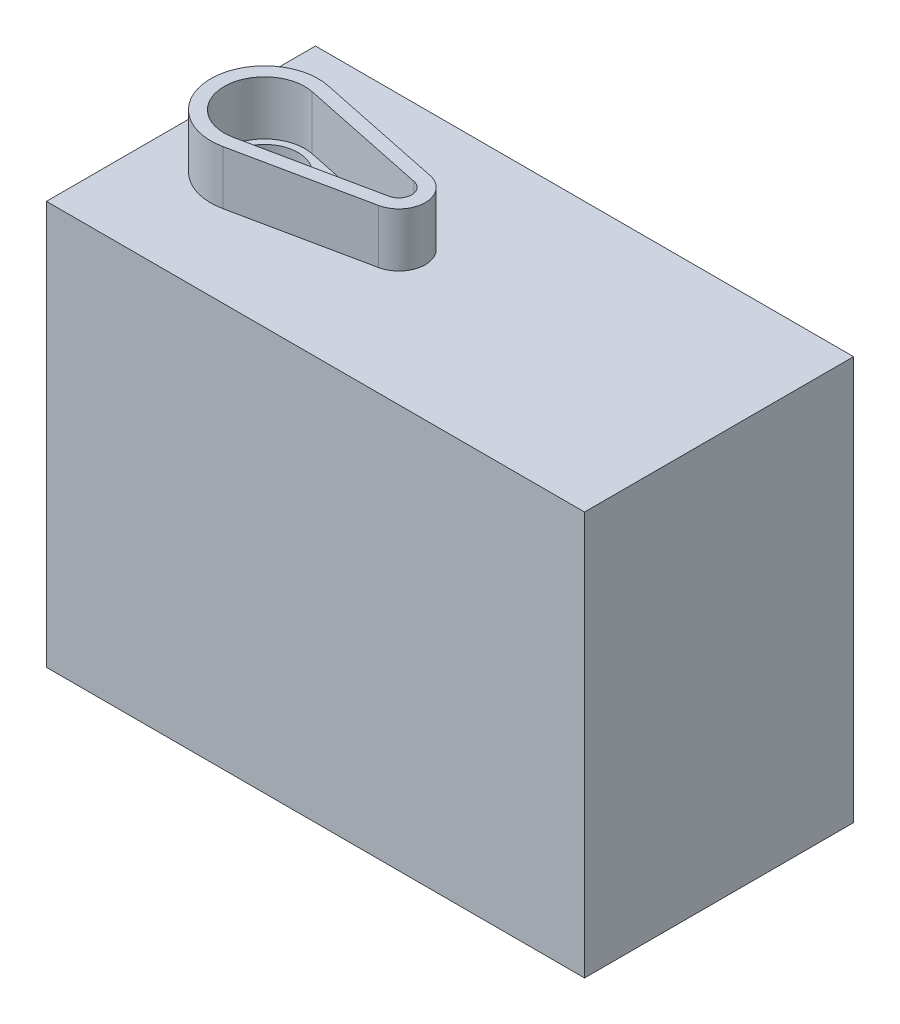
ISO-10303-21;
HEADER;
FILE_DESCRIPTION(('STEP AP214'),'2;1');
FILE_NAME('part.step','',(''),(''),'','','');
FILE_SCHEMA(('AUTOMOTIVE_DESIGN { 1 0 10303 214 1 1 1 1 }'));
ENDSEC;
DATA;
#1=APPLICATION_CONTEXT('core data for automotive mechanical design processes');
#2=APPLICATION_PROTOCOL_DEFINITION('international standard','automotive_design',2000,#1);
#3=PRODUCT_CONTEXT('',#1,'mechanical');
#4=PRODUCT('Part','Part','',(#3));
#5=PRODUCT_RELATED_PRODUCT_CATEGORY('part','',(#4));
#6=PRODUCT_DEFINITION_FORMATION('','',#4);
#7=PRODUCT_DEFINITION_CONTEXT('part definition',#1,'design');
#8=PRODUCT_DEFINITION('design','',#6,#7);
#9=PRODUCT_DEFINITION_SHAPE('','',#8);
#10=(LENGTH_UNIT() NAMED_UNIT(*) SI_UNIT(.MILLI.,.METRE.));
#11=(NAMED_UNIT(*) PLANE_ANGLE_UNIT() SI_UNIT($,.RADIAN.));
#12=(NAMED_UNIT(*) SI_UNIT($,.STERADIAN.) SOLID_ANGLE_UNIT());
#13=UNCERTAINTY_MEASURE_WITH_UNIT(LENGTH_MEASURE(1.E-05),#10,'distance_accuracy_value','');
#14=(GEOMETRIC_REPRESENTATION_CONTEXT(3) GLOBAL_UNCERTAINTY_ASSIGNED_CONTEXT((#13)) GLOBAL_UNIT_ASSIGNED_CONTEXT((#10,
#11,#12)) REPRESENTATION_CONTEXT('',''));
#15=CARTESIAN_POINT('',(0.,0.,0.));
#16=DIRECTION('',(0.,0.,1.));
#17=DIRECTION('',(1.,0.,0.));
#18=AXIS2_PLACEMENT_3D('',#15,#16,#17);
#19=CARTESIAN_POINT('',(-20.,15.,-20.));
#20=DIRECTION('',(0.,1.,0.));
#21=DIRECTION('',(0.,0.,1.));
#22=AXIS2_PLACEMENT_3D('',#19,#20,#21);
#23=PLANE('',#22);
#24=DIRECTION('',(-1.,0.,0.));
#25=VECTOR('',#24,1.);
#26=CARTESIAN_POINT('',(-20.,15.,0.));
#27=LINE('',#26,#25);
#28=CARTESIAN_POINT('',(20.,15.,0.));
#29=VERTEX_POINT('',#28);
#30=CARTESIAN_POINT('',(-20.,15.,0.));
#31=VERTEX_POINT('',#30);
#32=EDGE_CURVE('E212',#29,#31,#27,.T.);
#33=ORIENTED_EDGE('',*,*,#32,.F.);
#34=DIRECTION('',(0.,0.,1.));
#35=VECTOR('',#34,1.);
#36=CARTESIAN_POINT('',(20.,15.,-20.));
#37=LINE('',#36,#35);
#38=CARTESIAN_POINT('',(20.,15.,-20.));
#39=VERTEX_POINT('',#38);
#40=EDGE_CURVE('E41',#39,#29,#37,.T.);
#41=ORIENTED_EDGE('',*,*,#40,.F.);
#42=DIRECTION('',(-1.,0.,0.));
#43=VECTOR('',#42,1.);
#44=CARTESIAN_POINT('',(-20.,15.,-20.));
#45=LINE('',#44,#43);
#46=CARTESIAN_POINT('',(-20.,15.,-20.));
#47=VERTEX_POINT('',#46);
#48=EDGE_CURVE('E200',#39,#47,#45,.T.);
#49=ORIENTED_EDGE('',*,*,#48,.T.);
#50=DIRECTION('',(0.,0.,1.));
#51=VECTOR('',#50,1.);
#52=CARTESIAN_POINT('',(-20.,15.,-20.));
#53=LINE('',#52,#51);
#54=EDGE_CURVE('E220',#47,#31,#53,.T.);
#55=ORIENTED_EDGE('',*,*,#54,.T.);
#56=EDGE_LOOP('',(#33,#41,#49,#55));
#57=FACE_BOUND('',#56,.T.);
#58=DIRECTION('',(-0.979031865042361,0.,-0.203707160482092));
#59=VECTOR('',#58,1.);
#60=CARTESIAN_POINT('',(-12.9772287895981,15.,-13.9145891690941));
#61=LINE('',#60,#59);
#62=CARTESIAN_POINT('',(-3.4002945421564,15.,-11.921916457072));
#63=VERTEX_POINT('',#62);
#64=CARTESIAN_POINT('',(-12.9772287895981,15.,-13.9145891690941));
#65=VERTEX_POINT('',#64);
#66=EDGE_CURVE('E183',#63,#65,#61,.T.);
#67=ORIENTED_EDGE('',*,*,#66,.F.);
#68=CARTESIAN_POINT('',(-3.80018770001291,15.,-10.));
#69=DIRECTION('',(0.,1.,0.));
#70=DIRECTION('',(0.,0.,1.));
#71=AXIS2_PLACEMENT_3D('',#68,#69,#70);
#72=CIRCLE('',#71,1.96307855310594);
#73=CARTESIAN_POINT('',(-3.4002945421564,15.,-8.07808354292803));
#74=VERTEX_POINT('',#73);
#75=EDGE_CURVE('E146',#74,#63,#72,.T.);
#76=ORIENTED_EDGE('',*,*,#75,.F.);
#77=DIRECTION('',(0.979031865042361,0.,-0.203707160482093));
#78=VECTOR('',#77,1.);
#79=CARTESIAN_POINT('',(-12.9772287895981,15.,-6.0854108309059));
#80=LINE('',#79,#78);
#81=CARTESIAN_POINT('',(-12.9772287895981,15.,-6.0854108309059));
#82=VERTEX_POINT('',#81);
#83=EDGE_CURVE('E174',#82,#74,#80,.T.);
#84=ORIENTED_EDGE('',*,*,#83,.F.);
#85=CARTESIAN_POINT('',(-13.7917373593019,15.,-10.));
#86=DIRECTION('',(0.,1.,0.));
#87=DIRECTION('',(0.,0.,1.));
#88=AXIS2_PLACEMENT_3D('',#85,#86,#87);
#89=CIRCLE('',#88,3.99842876301552);
#90=EDGE_CURVE('E185',#65,#82,#89,.T.);
#91=ORIENTED_EDGE('',*,*,#90,.F.);
#92=EDGE_LOOP('',(#67,#76,#84,#91));
#93=FACE_BOUND('',#92,.T.);
#94=ADVANCED_FACE('F37',(#57,#93),#23,.T.);
#95=CARTESIAN_POINT('',(20.,15.,-20.));
#96=DIRECTION('',(1.,0.,0.));
#97=DIRECTION('',(0.,1.,0.));
#98=AXIS2_PLACEMENT_3D('',#95,#96,#97);
#99=PLANE('',#98);
#100=DIRECTION('',(0.,1.,0.));
#101=VECTOR('',#100,1.);
#102=CARTESIAN_POINT('',(20.,15.,0.));
#103=LINE('',#102,#101);
#104=CARTESIAN_POINT('',(20.,-15.,0.));
#105=VERTEX_POINT('',#104);
#106=EDGE_CURVE('E196',#105,#29,#103,.T.);
#107=ORIENTED_EDGE('',*,*,#106,.F.);
#108=DIRECTION('',(0.,0.,1.));
#109=VECTOR('',#108,1.);
#110=CARTESIAN_POINT('',(20.,-15.,-20.));
#111=LINE('',#110,#109);
#112=CARTESIAN_POINT('',(20.,-15.,-20.));
#113=VERTEX_POINT('',#112);
#114=EDGE_CURVE('E11',#113,#105,#111,.T.);
#115=ORIENTED_EDGE('',*,*,#114,.F.);
#116=DIRECTION('',(0.,1.,0.));
#117=VECTOR('',#116,1.);
#118=CARTESIAN_POINT('',(20.,15.,-20.));
#119=LINE('',#118,#117);
#120=EDGE_CURVE('E197',#113,#39,#119,.T.);
#121=ORIENTED_EDGE('',*,*,#120,.T.);
#122=ORIENTED_EDGE('',*,*,#40,.T.);
#123=EDGE_LOOP('',(#107,#115,#121,#122));
#124=FACE_BOUND('',#123,.T.);
#125=ADVANCED_FACE('F39',(#124),#99,.T.);
#126=CARTESIAN_POINT('',(-20.,-15.,-20.));
#127=DIRECTION('',(0.,-1.,0.));
#128=DIRECTION('',(0.,0.,-1.));
#129=AXIS2_PLACEMENT_3D('',#126,#127,#128);
#130=PLANE('',#129);
#131=DIRECTION('',(1.,0.,0.));
#132=VECTOR('',#131,1.);
#133=CARTESIAN_POINT('',(-20.,-15.,0.));
#134=LINE('',#133,#132);
#135=CARTESIAN_POINT('',(-20.,-15.,0.));
#136=VERTEX_POINT('',#135);
#137=EDGE_CURVE('E201',#136,#105,#134,.T.);
#138=ORIENTED_EDGE('',*,*,#137,.F.);
#139=DIRECTION('',(0.,0.,1.));
#140=VECTOR('',#139,1.);
#141=CARTESIAN_POINT('',(-20.,-15.,-20.));
#142=LINE('',#141,#140);
#143=CARTESIAN_POINT('',(-20.,-15.,-20.));
#144=VERTEX_POINT('',#143);
#145=EDGE_CURVE('E46',#144,#136,#142,.T.);
#146=ORIENTED_EDGE('',*,*,#145,.F.);
#147=DIRECTION('',(1.,0.,0.));
#148=VECTOR('',#147,1.);
#149=CARTESIAN_POINT('',(-20.,-15.,-20.));
#150=LINE('',#149,#148);
#151=EDGE_CURVE('E207',#144,#113,#150,.T.);
#152=ORIENTED_EDGE('',*,*,#151,.T.);
#153=ORIENTED_EDGE('',*,*,#114,.T.);
#154=EDGE_LOOP('',(#138,#146,#152,#153));
#155=FACE_BOUND('',#154,.T.);
#156=ADVANCED_FACE('F233',(#155),#130,.T.);
#157=CARTESIAN_POINT('',(-20.,15.,-20.));
#158=DIRECTION('',(-1.,0.,0.));
#159=DIRECTION('',(0.,-1.,0.));
#160=AXIS2_PLACEMENT_3D('',#157,#158,#159);
#161=PLANE('',#160);
#162=DIRECTION('',(0.,-1.,0.));
#163=VECTOR('',#162,1.);
#164=CARTESIAN_POINT('',(-20.,15.,0.));
#165=LINE('',#164,#163);
#166=EDGE_CURVE('E215',#31,#136,#165,.T.);
#167=ORIENTED_EDGE('',*,*,#166,.F.);
#168=ORIENTED_EDGE('',*,*,#54,.F.);
#169=DIRECTION('',(0.,-1.,0.));
#170=VECTOR('',#169,1.);
#171=CARTESIAN_POINT('',(-20.,15.,-20.));
#172=LINE('',#171,#170);
#173=EDGE_CURVE('E204',#47,#144,#172,.T.);
#174=ORIENTED_EDGE('',*,*,#173,.T.);
#175=ORIENTED_EDGE('',*,*,#145,.T.);
#176=EDGE_LOOP('',(#167,#168,#174,#175));
#177=FACE_BOUND('',#176,.T.);
#178=ADVANCED_FACE('F239',(#177),#161,.T.);
#179=CARTESIAN_POINT('',(0.,0.,-20.));
#180=DIRECTION('',(0.,0.,1.));
#181=DIRECTION('',(1.,0.,0.));
#182=AXIS2_PLACEMENT_3D('',#179,#180,#181);
#183=PLANE('',#182);
#184=ORIENTED_EDGE('',*,*,#120,.F.);
#185=ORIENTED_EDGE('',*,*,#151,.F.);
#186=ORIENTED_EDGE('',*,*,#173,.F.);
#187=ORIENTED_EDGE('',*,*,#48,.F.);
#188=EDGE_LOOP('',(#184,#185,#186,#187));
#189=FACE_BOUND('',#188,.T.);
#190=ADVANCED_FACE('F236',(#189),#183,.F.);
#191=CARTESIAN_POINT('',(0.,0.,0.));
#192=DIRECTION('',(0.,0.,1.));
#193=DIRECTION('',(1.,0.,0.));
#194=AXIS2_PLACEMENT_3D('',#191,#192,#193);
#195=PLANE('',#194);
#196=ORIENTED_EDGE('',*,*,#106,.T.);
#197=ORIENTED_EDGE('',*,*,#32,.T.);
#198=ORIENTED_EDGE('',*,*,#166,.T.);
#199=ORIENTED_EDGE('',*,*,#137,.T.);
#200=EDGE_LOOP('',(#196,#197,#198,#199));
#201=FACE_BOUND('',#200,.T.);
#202=ADVANCED_FACE('F230',(#201),#195,.T.);
#203=CARTESIAN_POINT('',(-3.80018770001291,19.,-10.));
#204=DIRECTION('',(0.,1.,0.));
#205=DIRECTION('',(0.,0.,1.));
#206=AXIS2_PLACEMENT_3D('',#203,#204,#205);
#207=PLANE('',#206);
#208=CARTESIAN_POINT('',(-3.80018770001291,19.,-10.));
#209=DIRECTION('',(0.,1.,0.));
#210=DIRECTION('',(0.,0.,1.));
#211=AXIS2_PLACEMENT_3D('',#208,#209,#210);
#212=CIRCLE('',#211,1.96307855310594);
#213=CARTESIAN_POINT('',(-3.4002945421564,19.,-8.07808354292803));
#214=VERTEX_POINT('',#213);
#215=CARTESIAN_POINT('',(-3.4002945421564,19.,-11.921916457072));
#216=VERTEX_POINT('',#215);
#217=EDGE_CURVE('E170',#214,#216,#212,.T.);
#218=ORIENTED_EDGE('',*,*,#217,.T.);
#219=DIRECTION('',(-0.979031865042361,0.,-0.203707160482092));
#220=VECTOR('',#219,1.);
#221=CARTESIAN_POINT('',(-12.9772287895981,19.,-13.9145891690941));
#222=LINE('',#221,#220);
#223=CARTESIAN_POINT('',(-12.9772287895981,19.,-13.9145891690941));
#224=VERTEX_POINT('',#223);
#225=EDGE_CURVE('E173',#216,#224,#222,.T.);
#226=ORIENTED_EDGE('',*,*,#225,.T.);
#227=CARTESIAN_POINT('',(-13.7917373593019,19.,-10.));
#228=DIRECTION('',(0.,1.,0.));
#229=DIRECTION('',(0.,0.,1.));
#230=AXIS2_PLACEMENT_3D('',#227,#228,#229);
#231=CIRCLE('',#230,3.99842876301552);
#232=CARTESIAN_POINT('',(-12.9772287895981,19.,-6.0854108309059));
#233=VERTEX_POINT('',#232);
#234=EDGE_CURVE('E176',#224,#233,#231,.T.);
#235=ORIENTED_EDGE('',*,*,#234,.T.);
#236=DIRECTION('',(0.979031865042361,0.,-0.203707160482093));
#237=VECTOR('',#236,1.);
#238=CARTESIAN_POINT('',(-12.9772287895981,19.,-6.0854108309059));
#239=LINE('',#238,#237);
#240=EDGE_CURVE('E178',#233,#214,#239,.T.);
#241=ORIENTED_EDGE('',*,*,#240,.T.);
#242=EDGE_LOOP('',(#218,#226,#235,#241));
#243=FACE_BOUND('',#242,.T.);
#244=DIRECTION('',(0.979031865042361,0.,-0.203707160482092));
#245=VECTOR('',#244,1.);
#246=CARTESIAN_POINT('',(-13.1809359500801,19.,-7.06444269594826));
#247=LINE('',#246,#245);
#248=CARTESIAN_POINT('',(-13.1809359500801,19.,-7.06444269594826));
#249=VERTEX_POINT('',#248);
#250=CARTESIAN_POINT('',(-3.6040017026385,19.,-9.05711540797039));
#251=VERTEX_POINT('',#250);
#252=EDGE_CURVE('E138',#249,#251,#247,.T.);
#253=ORIENTED_EDGE('',*,*,#252,.F.);
#254=CARTESIAN_POINT('',(-13.7917373593019,19.,-10.));
#255=DIRECTION('',(0.,1.,0.));
#256=DIRECTION('',(0.,0.,1.));
#257=AXIS2_PLACEMENT_3D('',#254,#255,#256);
#258=CIRCLE('',#257,2.99842876301552);
#259=CARTESIAN_POINT('',(-13.1809359500801,19.,-12.9355573040517));
#260=VERTEX_POINT('',#259);
#261=EDGE_CURVE('E129',#260,#249,#258,.T.);
#262=ORIENTED_EDGE('',*,*,#261,.F.);
#263=DIRECTION('',(-0.979031865042361,0.,-0.203707160482092));
#264=VECTOR('',#263,1.);
#265=CARTESIAN_POINT('',(-13.1809359500801,19.,-12.9355573040517));
#266=LINE('',#265,#264);
#267=CARTESIAN_POINT('',(-3.6040017026385,19.,-10.9428845920296));
#268=VERTEX_POINT('',#267);
#269=EDGE_CURVE('E154',#268,#260,#266,.T.);
#270=ORIENTED_EDGE('',*,*,#269,.F.);
#271=CARTESIAN_POINT('',(-3.80018770001291,19.,-10.));
#272=DIRECTION('',(0.,1.,0.));
#273=DIRECTION('',(0.,0.,1.));
#274=AXIS2_PLACEMENT_3D('',#271,#272,#273);
#275=CIRCLE('',#274,0.963078553105944);
#276=EDGE_CURVE('E152',#251,#268,#275,.T.);
#277=ORIENTED_EDGE('',*,*,#276,.F.);
#278=EDGE_LOOP('',(#253,#262,#270,#277));
#279=FACE_BOUND('',#278,.T.);
#280=ADVANCED_FACE('F150',(#243,#279),#207,.T.);
#281=CARTESIAN_POINT('',(-3.80018770001291,19.,-10.));
#282=DIRECTION('',(0.,-1.,0.));
#283=DIRECTION('',(0.,0.,-1.));
#284=AXIS2_PLACEMENT_3D('',#281,#282,#283);
#285=CYLINDRICAL_SURFACE('',#284,1.96307855310594);
#286=ORIENTED_EDGE('',*,*,#75,.T.);
#287=DIRECTION('',(0.,-1.,0.));
#288=VECTOR('',#287,1.);
#289=CARTESIAN_POINT('',(-3.4002945421564,19.,-11.921916457072));
#290=LINE('',#289,#288);
#291=EDGE_CURVE('E194',#216,#63,#290,.T.);
#292=ORIENTED_EDGE('',*,*,#291,.F.);
#293=ORIENTED_EDGE('',*,*,#217,.F.);
#294=DIRECTION('',(0.,-1.,0.));
#295=VECTOR('',#294,1.);
#296=CARTESIAN_POINT('',(-3.4002945421564,19.,-8.07808354292803));
#297=LINE('',#296,#295);
#298=EDGE_CURVE('E180',#214,#74,#297,.T.);
#299=ORIENTED_EDGE('',*,*,#298,.T.);
#300=EDGE_LOOP('',(#286,#292,#293,#299));
#301=FACE_BOUND('',#300,.T.);
#302=ADVANCED_FACE('F291',(#301),#285,.T.);
#303=CARTESIAN_POINT('',(-12.9772287895981,19.,-13.9145891690941));
#304=DIRECTION('',(-0.203707160482092,0.,0.979031865042361));
#305=DIRECTION('',(0.979031865042361,0.,0.203707160482092));
#306=AXIS2_PLACEMENT_3D('',#303,#304,#305);
#307=PLANE('',#306);
#308=ORIENTED_EDGE('',*,*,#66,.T.);
#309=DIRECTION('',(0.,-1.,0.));
#310=VECTOR('',#309,1.);
#311=CARTESIAN_POINT('',(-12.9772287895981,19.,-13.9145891690941));
#312=LINE('',#311,#310);
#313=EDGE_CURVE('E191',#224,#65,#312,.T.);
#314=ORIENTED_EDGE('',*,*,#313,.F.);
#315=ORIENTED_EDGE('',*,*,#225,.F.);
#316=ORIENTED_EDGE('',*,*,#291,.T.);
#317=EDGE_LOOP('',(#308,#314,#315,#316));
#318=FACE_BOUND('',#317,.T.);
#319=ADVANCED_FACE('F298',(#318),#307,.F.);
#320=CARTESIAN_POINT('',(-13.7917373593019,19.,-10.));
#321=DIRECTION('',(0.,-1.,0.));
#322=DIRECTION('',(0.,0.,-1.));
#323=AXIS2_PLACEMENT_3D('',#320,#321,#322);
#324=CYLINDRICAL_SURFACE('',#323,3.99842876301552);
#325=ORIENTED_EDGE('',*,*,#90,.T.);
#326=DIRECTION('',(0.,-1.,0.));
#327=VECTOR('',#326,1.);
#328=CARTESIAN_POINT('',(-12.9772287895981,19.,-6.0854108309059));
#329=LINE('',#328,#327);
#330=EDGE_CURVE('E54',#233,#82,#329,.T.);
#331=ORIENTED_EDGE('',*,*,#330,.F.);
#332=ORIENTED_EDGE('',*,*,#234,.F.);
#333=ORIENTED_EDGE('',*,*,#313,.T.);
#334=EDGE_LOOP('',(#325,#331,#332,#333));
#335=FACE_BOUND('',#334,.T.);
#336=ADVANCED_FACE('F295',(#335),#324,.T.);
#337=CARTESIAN_POINT('',(-12.9772287895981,19.,-6.0854108309059));
#338=DIRECTION('',(-0.203707160482093,0.,-0.979031865042361));
#339=DIRECTION('',(-0.979031865042361,0.,0.203707160482093));
#340=AXIS2_PLACEMENT_3D('',#337,#338,#339);
#341=PLANE('',#340);
#342=ORIENTED_EDGE('',*,*,#83,.T.);
#343=ORIENTED_EDGE('',*,*,#298,.F.);
#344=ORIENTED_EDGE('',*,*,#240,.F.);
#345=ORIENTED_EDGE('',*,*,#330,.T.);
#346=EDGE_LOOP('',(#342,#343,#344,#345));
#347=FACE_BOUND('',#346,.T.);
#348=ADVANCED_FACE('F289',(#347),#341,.F.);
#349=CARTESIAN_POINT('',(-13.7917373593019,19.,-10.));
#350=DIRECTION('',(0.,-1.,0.));
#351=DIRECTION('',(0.,0.,-1.));
#352=AXIS2_PLACEMENT_3D('',#349,#350,#351);
#353=CYLINDRICAL_SURFACE('',#352,2.99842876301552);
#354=CARTESIAN_POINT('',(-13.7917373593019,15.,-10.));
#355=DIRECTION('',(0.,1.,0.));
#356=DIRECTION('',(0.,0.,1.));
#357=AXIS2_PLACEMENT_3D('',#354,#355,#356);
#358=CIRCLE('',#357,2.99842876301552);
#359=CARTESIAN_POINT('',(-13.1809359500801,15.,-12.9355573040517));
#360=VERTEX_POINT('',#359);
#361=CARTESIAN_POINT('',(-13.1809359500801,15.,-7.06444269594826));
#362=VERTEX_POINT('',#361);
#363=EDGE_CURVE('E62',#360,#362,#358,.T.);
#364=ORIENTED_EDGE('',*,*,#363,.F.);
#365=DIRECTION('',(0.,-1.,0.));
#366=VECTOR('',#365,1.);
#367=CARTESIAN_POINT('',(-13.1809359500801,19.,-12.9355573040517));
#368=LINE('',#367,#366);
#369=EDGE_CURVE('E134',#260,#360,#368,.T.);
#370=ORIENTED_EDGE('',*,*,#369,.F.);
#371=ORIENTED_EDGE('',*,*,#261,.T.);
#372=DIRECTION('',(0.,-1.,0.));
#373=VECTOR('',#372,1.);
#374=CARTESIAN_POINT('',(-13.1809359500801,19.,-7.06444269594826));
#375=LINE('',#374,#373);
#376=EDGE_CURVE('E132',#249,#362,#375,.T.);
#377=ORIENTED_EDGE('',*,*,#376,.T.);
#378=EDGE_LOOP('',(#364,#370,#371,#377));
#379=FACE_BOUND('',#378,.T.);
#380=ADVANCED_FACE('F131',(#379),#353,.F.);
#381=CARTESIAN_POINT('',(-13.1809359500801,19.,-7.06444269594826));
#382=DIRECTION('',(-0.203707160482092,0.,-0.979031865042361));
#383=DIRECTION('',(-0.979031865042361,0.,0.203707160482092));
#384=AXIS2_PLACEMENT_3D('',#381,#382,#383);
#385=PLANE('',#384);
#386=DIRECTION('',(0.979031865042361,0.,-0.203707160482092));
#387=VECTOR('',#386,1.);
#388=CARTESIAN_POINT('',(-13.1809359500801,15.,-7.06444269594826));
#389=LINE('',#388,#387);
#390=CARTESIAN_POINT('',(-3.6040017026385,15.,-9.05711540797039));
#391=VERTEX_POINT('',#390);
#392=EDGE_CURVE('E145',#362,#391,#389,.T.);
#393=ORIENTED_EDGE('',*,*,#392,.F.);
#394=ORIENTED_EDGE('',*,*,#376,.F.);
#395=ORIENTED_EDGE('',*,*,#252,.T.);
#396=DIRECTION('',(0.,-1.,0.));
#397=VECTOR('',#396,1.);
#398=CARTESIAN_POINT('',(-3.6040017026385,19.,-9.05711540797039));
#399=LINE('',#398,#397);
#400=EDGE_CURVE('E147',#251,#391,#399,.T.);
#401=ORIENTED_EDGE('',*,*,#400,.T.);
#402=EDGE_LOOP('',(#393,#394,#395,#401));
#403=FACE_BOUND('',#402,.T.);
#404=ADVANCED_FACE('F142',(#403),#385,.T.);
#405=CARTESIAN_POINT('',(-3.80018770001291,19.,-10.));
#406=DIRECTION('',(0.,-1.,0.));
#407=DIRECTION('',(0.,0.,-1.));
#408=AXIS2_PLACEMENT_3D('',#405,#406,#407);
#409=CYLINDRICAL_SURFACE('',#408,0.963078553105944);
#410=CARTESIAN_POINT('',(-3.80018770001291,15.,-10.));
#411=DIRECTION('',(0.,1.,0.));
#412=DIRECTION('',(0.,0.,1.));
#413=AXIS2_PLACEMENT_3D('',#410,#411,#412);
#414=CIRCLE('',#413,0.963078553105944);
#415=CARTESIAN_POINT('',(-3.6040017026385,15.,-10.9428845920296));
#416=VERTEX_POINT('',#415);
#417=EDGE_CURVE('E162',#391,#416,#414,.T.);
#418=ORIENTED_EDGE('',*,*,#417,.F.);
#419=ORIENTED_EDGE('',*,*,#400,.F.);
#420=ORIENTED_EDGE('',*,*,#276,.T.);
#421=DIRECTION('',(0.,-1.,0.));
#422=VECTOR('',#421,1.);
#423=CARTESIAN_POINT('',(-3.6040017026385,19.,-10.9428845920296));
#424=LINE('',#423,#422);
#425=EDGE_CURVE('E166',#268,#416,#424,.T.);
#426=ORIENTED_EDGE('',*,*,#425,.T.);
#427=EDGE_LOOP('',(#418,#419,#420,#426));
#428=FACE_BOUND('',#427,.T.);
#429=ADVANCED_FACE('F266',(#428),#409,.F.);
#430=CARTESIAN_POINT('',(-13.1809359500801,19.,-12.9355573040517));
#431=DIRECTION('',(-0.203707160482092,0.,0.979031865042361));
#432=DIRECTION('',(0.979031865042361,0.,0.203707160482092));
#433=AXIS2_PLACEMENT_3D('',#430,#431,#432);
#434=PLANE('',#433);
#435=DIRECTION('',(-0.979031865042361,0.,-0.203707160482092));
#436=VECTOR('',#435,1.);
#437=CARTESIAN_POINT('',(-13.1809359500801,15.,-12.9355573040517));
#438=LINE('',#437,#436);
#439=EDGE_CURVE('E139',#416,#360,#438,.T.);
#440=ORIENTED_EDGE('',*,*,#439,.F.);
#441=ORIENTED_EDGE('',*,*,#425,.F.);
#442=ORIENTED_EDGE('',*,*,#269,.T.);
#443=ORIENTED_EDGE('',*,*,#369,.T.);
#444=EDGE_LOOP('',(#440,#441,#442,#443));
#445=FACE_BOUND('',#444,.T.);
#446=ADVANCED_FACE('F257',(#445),#434,.T.);
#447=CARTESIAN_POINT('',(-13.7917373593019,15.,-10.));
#448=DIRECTION('',(0.,1.,0.));
#449=DIRECTION('',(0.,0.,1.));
#450=AXIS2_PLACEMENT_3D('',#447,#448,#449);
#451=CIRCLE('',#450,2.5);
#452=CARTESIAN_POINT('',(-13.7917373593019,15.,-7.5));
#453=VERTEX_POINT('',#452);
#454=EDGE_CURVE('E271',#453,#453,#451,.T.);
#455=ORIENTED_EDGE('',*,*,#454,.F.);
#456=EDGE_LOOP('',(#455));
#457=FACE_BOUND('',#456,.T.);
#458=ORIENTED_EDGE('',*,*,#363,.T.);
#459=ORIENTED_EDGE('',*,*,#392,.T.);
#460=ORIENTED_EDGE('',*,*,#417,.T.);
#461=ORIENTED_EDGE('',*,*,#439,.T.);
#462=EDGE_LOOP('',(#458,#459,#460,#461));
#463=FACE_BOUND('',#462,.T.);
#464=ADVANCED_FACE('F249',(#457,#463),#23,.T.);
#465=CARTESIAN_POINT('',(-13.7917373593019,10.,-10.));
#466=DIRECTION('',(0.,1.,0.));
#467=DIRECTION('',(0.,0.,1.));
#468=AXIS2_PLACEMENT_3D('',#465,#466,#467);
#469=CYLINDRICAL_SURFACE('',#468,2.5);
#470=CARTESIAN_POINT('',(-13.7917373593019,10.,-10.));
#471=DIRECTION('',(0.,1.,0.));
#472=DIRECTION('',(0.,0.,1.));
#473=AXIS2_PLACEMENT_3D('',#470,#471,#472);
#474=CIRCLE('',#473,2.5);
#475=CARTESIAN_POINT('',(-13.7917373593019,10.,-7.5));
#476=VERTEX_POINT('',#475);
#477=EDGE_CURVE('E160',#476,#476,#474,.T.);
#478=ORIENTED_EDGE('',*,*,#477,.F.);
#479=EDGE_LOOP('',(#478));
#480=FACE_BOUND('',#479,.T.);
#481=ORIENTED_EDGE('',*,*,#454,.T.);
#482=EDGE_LOOP('',(#481));
#483=FACE_BOUND('',#482,.T.);
#484=ADVANCED_FACE('F256',(#480,#483),#469,.F.);
#485=CARTESIAN_POINT('',(-13.7917373593019,10.,-10.));
#486=DIRECTION('',(0.,1.,0.));
#487=DIRECTION('',(0.,0.,1.));
#488=AXIS2_PLACEMENT_3D('',#485,#486,#487);
#489=PLANE('',#488);
#490=ORIENTED_EDGE('',*,*,#477,.T.);
#491=EDGE_LOOP('',(#490));
#492=FACE_BOUND('',#491,.T.);
#493=ADVANCED_FACE('F263',(#492),#489,.T.);
#494=CLOSED_SHELL('',(#94,#125,#156,#178,#190,#202,#280,#302,#319,#336,#348,#380,#404,#429,#446,
#464,#484,#493));
#495=MANIFOLD_SOLID_BREP('B2',#494);
#496=ADVANCED_BREP_SHAPE_REPRESENTATION('',(#18,#495),#14);
#497=SHAPE_DEFINITION_REPRESENTATION(#9,#496);
ENDSEC;
END-ISO-10303-21;
